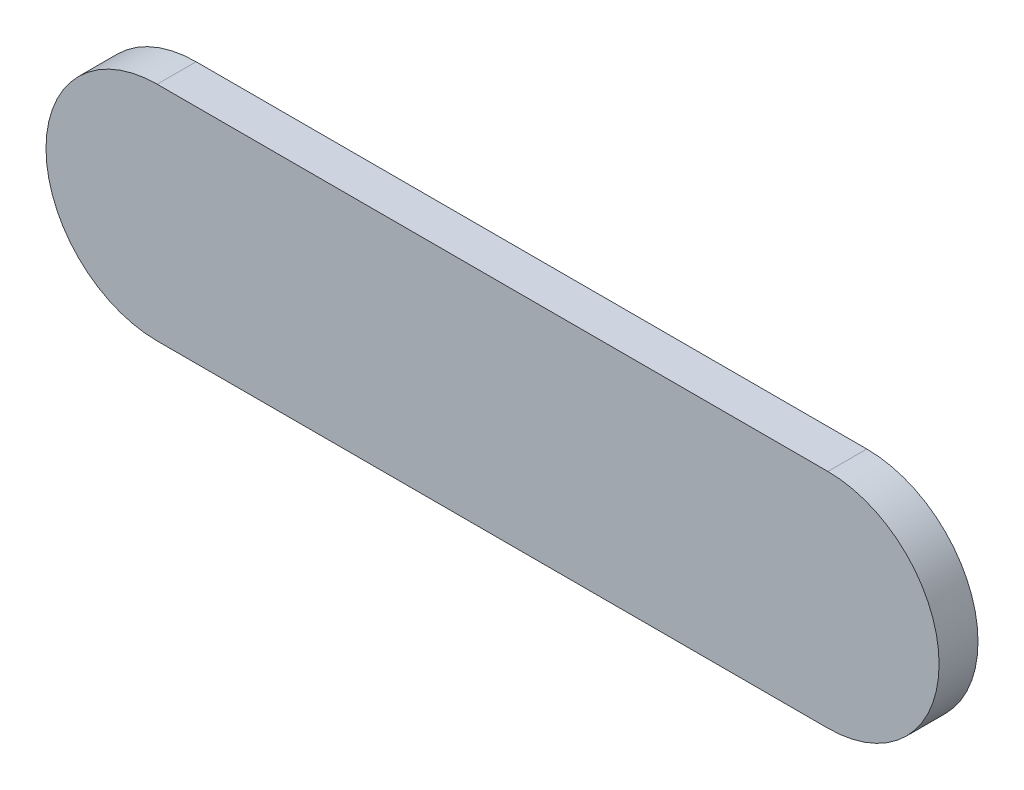
ISO-10303-21;
HEADER;
FILE_DESCRIPTION(('STEP AP214'),'2;1');
FILE_NAME('part.step','',(''),(''),'','','');
FILE_SCHEMA(('AUTOMOTIVE_DESIGN { 1 0 10303 214 1 1 1 1 }'));
ENDSEC;
DATA;
#1=APPLICATION_CONTEXT('core data for automotive mechanical design processes');
#2=APPLICATION_PROTOCOL_DEFINITION('international standard','automotive_design',2000,#1);
#3=PRODUCT_CONTEXT('',#1,'mechanical');
#4=PRODUCT('Part','Part','',(#3));
#5=PRODUCT_RELATED_PRODUCT_CATEGORY('part','',(#4));
#6=PRODUCT_DEFINITION_FORMATION('','',#4);
#7=PRODUCT_DEFINITION_CONTEXT('part definition',#1,'design');
#8=PRODUCT_DEFINITION('design','',#6,#7);
#9=PRODUCT_DEFINITION_SHAPE('','',#8);
#10=(LENGTH_UNIT() NAMED_UNIT(*) SI_UNIT(.MILLI.,.METRE.));
#11=(NAMED_UNIT(*) PLANE_ANGLE_UNIT() SI_UNIT($,.RADIAN.));
#12=(NAMED_UNIT(*) SI_UNIT($,.STERADIAN.) SOLID_ANGLE_UNIT());
#13=UNCERTAINTY_MEASURE_WITH_UNIT(LENGTH_MEASURE(1.E-05),#10,'distance_accuracy_value','');
#14=(GEOMETRIC_REPRESENTATION_CONTEXT(3) GLOBAL_UNCERTAINTY_ASSIGNED_CONTEXT((#13)) GLOBAL_UNIT_ASSIGNED_CONTEXT((#10,
#11,#12)) REPRESENTATION_CONTEXT('',''));
#15=CARTESIAN_POINT('',(0.,0.,0.));
#16=DIRECTION('',(0.,0.,1.));
#17=DIRECTION('',(1.,0.,0.));
#18=AXIS2_PLACEMENT_3D('',#15,#16,#17);
#19=CARTESIAN_POINT('',(85.990686,-111.8,1.635));
#20=DIRECTION('',(0.,0.,1.));
#21=DIRECTION('',(1.,0.,0.));
#22=AXIS2_PLACEMENT_3D('',#19,#20,#21);
#23=PLANE('',#22);
#24=DIRECTION('',(-1.,0.,0.));
#25=VECTOR('',#24,1.);
#26=CARTESIAN_POINT('',(85.990686,-111.8,1.635));
#27=LINE('',#26,#25);
#28=CARTESIAN_POINT('',(85.990686,-111.8,1.635));
#29=VERTEX_POINT('',#28);
#30=CARTESIAN_POINT('',(85.3875,-111.8,1.635));
#31=VERTEX_POINT('',#30);
#32=EDGE_CURVE('E77',#29,#31,#27,.T.);
#33=ORIENTED_EDGE('',*,*,#32,.T.);
#34=CARTESIAN_POINT('',(85.3875,-111.9,1.635));
#35=DIRECTION('',(0.,0.,1.));
#36=DIRECTION('',(0.,1.,0.));
#37=AXIS2_PLACEMENT_3D('',#34,#35,#36);
#38=CIRCLE('',#37,0.1);
#39=CARTESIAN_POINT('',(85.3875,-112.,1.635));
#40=VERTEX_POINT('',#39);
#41=EDGE_CURVE('E75',#31,#40,#38,.T.);
#42=ORIENTED_EDGE('',*,*,#41,.T.);
#43=DIRECTION('',(1.,0.,0.));
#44=VECTOR('',#43,1.);
#45=CARTESIAN_POINT('',(85.3875,-112.,1.635));
#46=LINE('',#45,#44);
#47=CARTESIAN_POINT('',(85.990686,-112.,1.635));
#48=VERTEX_POINT('',#47);
#49=EDGE_CURVE('E63',#40,#48,#46,.T.);
#50=ORIENTED_EDGE('',*,*,#49,.T.);
#51=CARTESIAN_POINT('',(85.990686,-111.9,1.635));
#52=DIRECTION('',(0.,0.,1.));
#53=DIRECTION('',(0.,-1.,0.));
#54=AXIS2_PLACEMENT_3D('',#51,#52,#53);
#55=CIRCLE('',#54,0.1);
#56=EDGE_CURVE('E11',#48,#29,#55,.T.);
#57=ORIENTED_EDGE('',*,*,#56,.T.);
#58=EDGE_LOOP('',(#33,#42,#50,#57));
#59=FACE_BOUND('',#58,.T.);
#60=ADVANCED_FACE('F17',(#59),#23,.T.);
#61=CARTESIAN_POINT('',(85.990686,-111.8,1.6));
#62=DIRECTION('',(0.,0.,1.));
#63=DIRECTION('',(1.,0.,0.));
#64=AXIS2_PLACEMENT_3D('',#61,#62,#63);
#65=PLANE('',#64);
#66=CARTESIAN_POINT('',(85.990686,-111.9,1.6));
#67=DIRECTION('',(0.,0.,1.));
#68=DIRECTION('',(0.,-1.,0.));
#69=AXIS2_PLACEMENT_3D('',#66,#67,#68);
#70=CIRCLE('',#69,0.1);
#71=CARTESIAN_POINT('',(85.990686,-112.,1.6));
#72=VERTEX_POINT('',#71);
#73=CARTESIAN_POINT('',(85.990686,-111.8,1.6));
#74=VERTEX_POINT('',#73);
#75=EDGE_CURVE('E26',#72,#74,#70,.T.);
#76=ORIENTED_EDGE('',*,*,#75,.F.);
#77=DIRECTION('',(1.,0.,0.));
#78=VECTOR('',#77,1.);
#79=CARTESIAN_POINT('',(85.3875,-112.,1.6));
#80=LINE('',#79,#78);
#81=CARTESIAN_POINT('',(85.3875,-112.,1.6));
#82=VERTEX_POINT('',#81);
#83=EDGE_CURVE('E82',#82,#72,#80,.T.);
#84=ORIENTED_EDGE('',*,*,#83,.F.);
#85=CARTESIAN_POINT('',(85.3875,-111.9,1.6));
#86=DIRECTION('',(0.,0.,1.));
#87=DIRECTION('',(0.,1.,0.));
#88=AXIS2_PLACEMENT_3D('',#85,#86,#87);
#89=CIRCLE('',#88,0.1);
#90=CARTESIAN_POINT('',(85.3875,-111.8,1.6));
#91=VERTEX_POINT('',#90);
#92=EDGE_CURVE('E84',#91,#82,#89,.T.);
#93=ORIENTED_EDGE('',*,*,#92,.F.);
#94=DIRECTION('',(-1.,0.,0.));
#95=VECTOR('',#94,1.);
#96=CARTESIAN_POINT('',(85.990686,-111.8,1.6));
#97=LINE('',#96,#95);
#98=EDGE_CURVE('E105',#74,#91,#97,.T.);
#99=ORIENTED_EDGE('',*,*,#98,.F.);
#100=EDGE_LOOP('',(#76,#84,#93,#99));
#101=FACE_BOUND('',#100,.T.);
#102=ADVANCED_FACE('F161',(#101),#65,.F.);
#103=CARTESIAN_POINT('',(85.990686,-111.9,1.6));
#104=DIRECTION('',(0.,0.,-1.));
#105=DIRECTION('',(0.,-1.,0.));
#106=AXIS2_PLACEMENT_3D('',#103,#104,#105);
#107=CYLINDRICAL_SURFACE('',#106,0.1);
#108=ORIENTED_EDGE('',*,*,#75,.T.);
#109=DIRECTION('',(0.,0.,1.));
#110=VECTOR('',#109,1.);
#111=CARTESIAN_POINT('',(85.990686,-111.8,1.6));
#112=LINE('',#111,#110);
#113=EDGE_CURVE('E91',#74,#29,#112,.T.);
#114=ORIENTED_EDGE('',*,*,#113,.T.);
#115=ORIENTED_EDGE('',*,*,#56,.F.);
#116=DIRECTION('',(0.,0.,1.));
#117=VECTOR('',#116,1.);
#118=CARTESIAN_POINT('',(85.990686,-112.,1.6));
#119=LINE('',#118,#117);
#120=EDGE_CURVE('E70',#72,#48,#119,.T.);
#121=ORIENTED_EDGE('',*,*,#120,.F.);
#122=EDGE_LOOP('',(#108,#114,#115,#121));
#123=FACE_BOUND('',#122,.T.);
#124=ADVANCED_FACE('F153',(#123),#107,.T.);
#125=CARTESIAN_POINT('',(85.3875,-112.,1.6));
#126=DIRECTION('',(0.,1.,0.));
#127=DIRECTION('',(1.,0.,0.));
#128=AXIS2_PLACEMENT_3D('',#125,#126,#127);
#129=PLANE('',#128);
#130=ORIENTED_EDGE('',*,*,#83,.T.);
#131=ORIENTED_EDGE('',*,*,#120,.T.);
#132=ORIENTED_EDGE('',*,*,#49,.F.);
#133=DIRECTION('',(0.,0.,1.));
#134=VECTOR('',#133,1.);
#135=CARTESIAN_POINT('',(85.3875,-112.,1.6));
#136=LINE('',#135,#134);
#137=EDGE_CURVE('E68',#82,#40,#136,.T.);
#138=ORIENTED_EDGE('',*,*,#137,.F.);
#139=EDGE_LOOP('',(#130,#131,#132,#138));
#140=FACE_BOUND('',#139,.T.);
#141=ADVANCED_FACE('F66',(#140),#129,.F.);
#142=CARTESIAN_POINT('',(85.3875,-111.9,1.6));
#143=DIRECTION('',(0.,0.,-1.));
#144=DIRECTION('',(0.,1.,0.));
#145=AXIS2_PLACEMENT_3D('',#142,#143,#144);
#146=CYLINDRICAL_SURFACE('',#145,0.1);
#147=ORIENTED_EDGE('',*,*,#92,.T.);
#148=ORIENTED_EDGE('',*,*,#137,.T.);
#149=ORIENTED_EDGE('',*,*,#41,.F.);
#150=DIRECTION('',(0.,0.,1.));
#151=VECTOR('',#150,1.);
#152=CARTESIAN_POINT('',(85.3875,-111.8,1.6));
#153=LINE('',#152,#151);
#154=EDGE_CURVE('E103',#91,#31,#153,.T.);
#155=ORIENTED_EDGE('',*,*,#154,.F.);
#156=EDGE_LOOP('',(#147,#148,#149,#155));
#157=FACE_BOUND('',#156,.T.);
#158=ADVANCED_FACE('F83',(#157),#146,.T.);
#159=CARTESIAN_POINT('',(85.990686,-111.8,1.6));
#160=DIRECTION('',(0.,-1.,0.));
#161=DIRECTION('',(0.,0.,-1.));
#162=AXIS2_PLACEMENT_3D('',#159,#160,#161);
#163=PLANE('',#162);
#164=ORIENTED_EDGE('',*,*,#98,.T.);
#165=ORIENTED_EDGE('',*,*,#154,.T.);
#166=ORIENTED_EDGE('',*,*,#32,.F.);
#167=ORIENTED_EDGE('',*,*,#113,.F.);
#168=EDGE_LOOP('',(#164,#165,#166,#167));
#169=FACE_BOUND('',#168,.T.);
#170=ADVANCED_FACE('F134',(#169),#163,.F.);
#171=CLOSED_SHELL('',(#60,#102,#124,#141,#158,#170));
#172=MANIFOLD_SOLID_BREP('B1',#171);
#173=ADVANCED_BREP_SHAPE_REPRESENTATION('',(#18,#172),#14);
#174=SHAPE_DEFINITION_REPRESENTATION(#9,#173);
ENDSEC;
END-ISO-10303-21;
